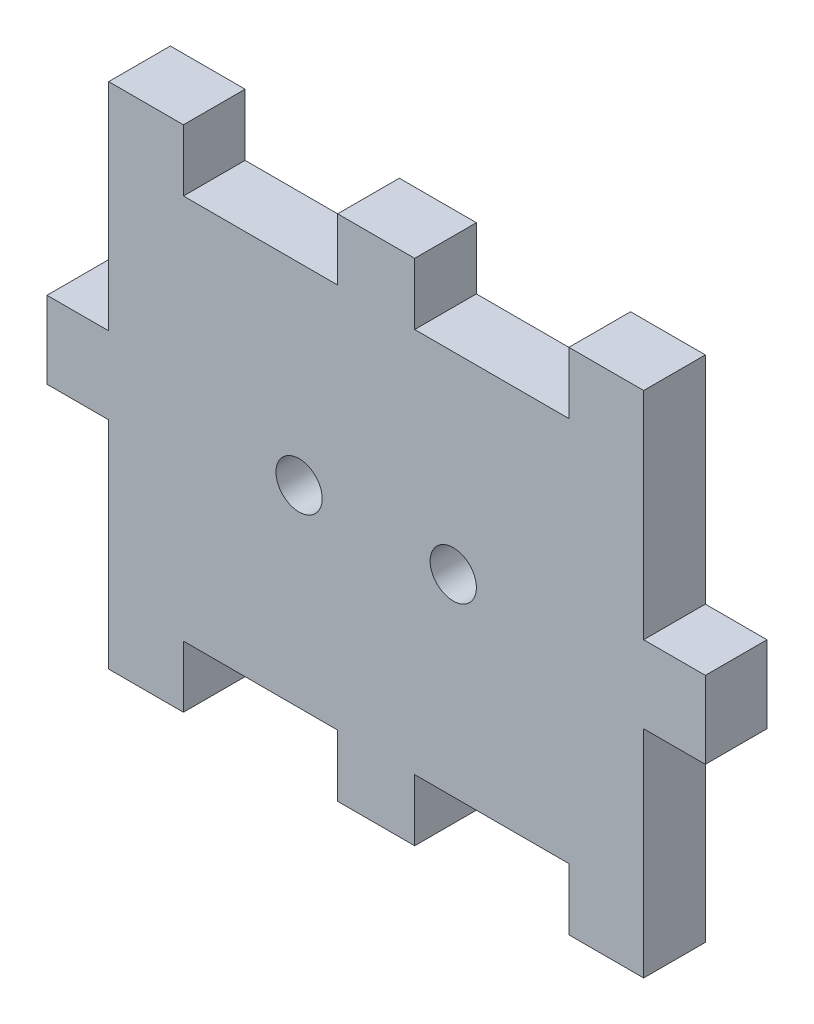
ISO-10303-21;
HEADER;
FILE_DESCRIPTION(('STEP AP214'),'2;1');
FILE_NAME('part.step','',(''),(''),'','','');
FILE_SCHEMA(('AUTOMOTIVE_DESIGN { 1 0 10303 214 1 1 1 1 }'));
ENDSEC;
DATA;
#1=APPLICATION_CONTEXT('core data for automotive mechanical design processes');
#2=APPLICATION_PROTOCOL_DEFINITION('international standard','automotive_design',2000,#1);
#3=PRODUCT_CONTEXT('',#1,'mechanical');
#4=PRODUCT('Part','Part','',(#3));
#5=PRODUCT_RELATED_PRODUCT_CATEGORY('part','',(#4));
#6=PRODUCT_DEFINITION_FORMATION('','',#4);
#7=PRODUCT_DEFINITION_CONTEXT('part definition',#1,'design');
#8=PRODUCT_DEFINITION('design','',#6,#7);
#9=PRODUCT_DEFINITION_SHAPE('','',#8);
#10=(LENGTH_UNIT() NAMED_UNIT(*) SI_UNIT(.MILLI.,.METRE.));
#11=(NAMED_UNIT(*) PLANE_ANGLE_UNIT() SI_UNIT($,.RADIAN.));
#12=(NAMED_UNIT(*) SI_UNIT($,.STERADIAN.) SOLID_ANGLE_UNIT());
#13=UNCERTAINTY_MEASURE_WITH_UNIT(LENGTH_MEASURE(1.E-05),#10,'distance_accuracy_value','');
#14=(GEOMETRIC_REPRESENTATION_CONTEXT(3) GLOBAL_UNCERTAINTY_ASSIGNED_CONTEXT((#13)) GLOBAL_UNIT_ASSIGNED_CONTEXT((#10,
#11,#12)) REPRESENTATION_CONTEXT('',''));
#15=CARTESIAN_POINT('',(0.,0.,0.));
#16=DIRECTION('',(0.,0.,1.));
#17=DIRECTION('',(1.,0.,0.));
#18=AXIS2_PLACEMENT_3D('',#15,#16,#17);
#19=CARTESIAN_POINT('',(-4.,-4.,4.));
#20=DIRECTION('',(0.,1.,0.));
#21=DIRECTION('',(0.,0.,1.));
#22=AXIS2_PLACEMENT_3D('',#19,#20,#21);
#23=PLANE('',#22);
#24=DIRECTION('',(1.,0.,0.));
#25=VECTOR('',#24,1.);
#26=CARTESIAN_POINT('',(-4.,-4.,0.));
#27=LINE('',#26,#25);
#28=CARTESIAN_POINT('',(0.,-4.,0.));
#29=VERTEX_POINT('',#28);
#30=CARTESIAN_POINT('',(4.85,-4.,0.));
#31=VERTEX_POINT('',#30);
#32=EDGE_CURVE('E258',#29,#31,#27,.T.);
#33=ORIENTED_EDGE('',*,*,#32,.T.);
#34=DIRECTION('',(0.,0.,1.));
#35=VECTOR('',#34,1.);
#36=CARTESIAN_POINT('',(4.85,-4.,0.));
#37=LINE('',#36,#35);
#38=CARTESIAN_POINT('',(4.85,-4.,4.));
#39=VERTEX_POINT('',#38);
#40=EDGE_CURVE('E461',#31,#39,#37,.T.);
#41=ORIENTED_EDGE('',*,*,#40,.T.);
#42=DIRECTION('',(1.,0.,0.));
#43=VECTOR('',#42,1.);
#44=CARTESIAN_POINT('',(-4.,-4.,4.));
#45=LINE('',#44,#43);
#46=CARTESIAN_POINT('',(0.,-4.,4.));
#47=VERTEX_POINT('',#46);
#48=EDGE_CURVE('E299',#47,#39,#45,.T.);
#49=ORIENTED_EDGE('',*,*,#48,.F.);
#50=DIRECTION('',(0.,0.,1.));
#51=VECTOR('',#50,1.);
#52=CARTESIAN_POINT('',(0.,-4.,0.));
#53=LINE('',#52,#51);
#54=EDGE_CURVE('E440',#29,#47,#53,.T.);
#55=ORIENTED_EDGE('',*,*,#54,.F.);
#56=EDGE_LOOP('',(#33,#41,#49,#55));
#57=FACE_BOUND('',#56,.T.);
#58=ADVANCED_FACE('F42',(#57),#23,.F.);
#59=CARTESIAN_POINT('',(29.85,-4.,0.));
#60=VERTEX_POINT('',#59);
#61=CARTESIAN_POINT('',(34.7,-4.,0.));
#62=VERTEX_POINT('',#61);
#63=EDGE_CURVE('E259',#60,#62,#27,.T.);
#64=ORIENTED_EDGE('',*,*,#63,.T.);
#65=DIRECTION('',(0.,0.,1.));
#66=VECTOR('',#65,1.);
#67=CARTESIAN_POINT('',(34.7,-4.,0.));
#68=LINE('',#67,#66);
#69=CARTESIAN_POINT('',(34.7,-4.,4.));
#70=VERTEX_POINT('',#69);
#71=EDGE_CURVE('E347',#62,#70,#68,.T.);
#72=ORIENTED_EDGE('',*,*,#71,.T.);
#73=CARTESIAN_POINT('',(29.85,-4.,4.));
#74=VERTEX_POINT('',#73);
#75=EDGE_CURVE('E291',#74,#70,#45,.T.);
#76=ORIENTED_EDGE('',*,*,#75,.F.);
#77=DIRECTION('',(0.,0.,1.));
#78=VECTOR('',#77,1.);
#79=CARTESIAN_POINT('',(29.85,-4.,0.));
#80=LINE('',#79,#78);
#81=EDGE_CURVE('E472',#60,#74,#80,.T.);
#82=ORIENTED_EDGE('',*,*,#81,.F.);
#83=EDGE_LOOP('',(#64,#72,#76,#82));
#84=FACE_BOUND('',#83,.T.);
#85=ADVANCED_FACE('F638',(#84),#23,.F.);
#86=CARTESIAN_POINT('',(-4.,29.,4.));
#87=DIRECTION('',(0.,-1.,0.));
#88=DIRECTION('',(0.,0.,-1.));
#89=AXIS2_PLACEMENT_3D('',#86,#87,#88);
#90=PLANE('',#89);
#91=DIRECTION('',(-1.,0.,0.));
#92=VECTOR('',#91,1.);
#93=CARTESIAN_POINT('',(-4.,29.,4.));
#94=LINE('',#93,#92);
#95=CARTESIAN_POINT('',(34.7,29.,4.));
#96=VERTEX_POINT('',#95);
#97=CARTESIAN_POINT('',(29.85,29.,4.));
#98=VERTEX_POINT('',#97);
#99=EDGE_CURVE('E52',#96,#98,#94,.T.);
#100=ORIENTED_EDGE('',*,*,#99,.F.);
#101=DIRECTION('',(0.,0.,1.));
#102=VECTOR('',#101,1.);
#103=CARTESIAN_POINT('',(34.7,29.,0.));
#104=LINE('',#103,#102);
#105=CARTESIAN_POINT('',(34.7,29.,0.));
#106=VERTEX_POINT('',#105);
#107=EDGE_CURVE('E594',#106,#96,#104,.T.);
#108=ORIENTED_EDGE('',*,*,#107,.F.);
#109=DIRECTION('',(-1.,0.,0.));
#110=VECTOR('',#109,1.);
#111=CARTESIAN_POINT('',(-4.,29.,0.));
#112=LINE('',#111,#110);
#113=CARTESIAN_POINT('',(29.85,29.,0.));
#114=VERTEX_POINT('',#113);
#115=EDGE_CURVE('E276',#106,#114,#112,.T.);
#116=ORIENTED_EDGE('',*,*,#115,.T.);
#117=DIRECTION('',(0.,0.,1.));
#118=VECTOR('',#117,1.);
#119=CARTESIAN_POINT('',(29.85,29.,0.));
#120=LINE('',#119,#118);
#121=EDGE_CURVE('E386',#114,#98,#120,.T.);
#122=ORIENTED_EDGE('',*,*,#121,.T.);
#123=EDGE_LOOP('',(#100,#108,#116,#122));
#124=FACE_BOUND('',#123,.T.);
#125=ADVANCED_FACE('F643',(#124),#90,.F.);
#126=CARTESIAN_POINT('',(4.85,29.,0.));
#127=VERTEX_POINT('',#126);
#128=CARTESIAN_POINT('',(0.,29.,0.));
#129=VERTEX_POINT('',#128);
#130=EDGE_CURVE('E272',#127,#129,#112,.T.);
#131=ORIENTED_EDGE('',*,*,#130,.T.);
#132=DIRECTION('',(0.,0.,1.));
#133=VECTOR('',#132,1.);
#134=CARTESIAN_POINT('',(0.,29.,0.));
#135=LINE('',#134,#133);
#136=CARTESIAN_POINT('',(0.,29.,4.));
#137=VERTEX_POINT('',#136);
#138=EDGE_CURVE('E551',#129,#137,#135,.T.);
#139=ORIENTED_EDGE('',*,*,#138,.T.);
#140=CARTESIAN_POINT('',(4.85,29.,4.));
#141=VERTEX_POINT('',#140);
#142=EDGE_CURVE('E316',#141,#137,#94,.T.);
#143=ORIENTED_EDGE('',*,*,#142,.F.);
#144=DIRECTION('',(0.,0.,1.));
#145=VECTOR('',#144,1.);
#146=CARTESIAN_POINT('',(4.85,29.,0.));
#147=LINE('',#146,#145);
#148=EDGE_CURVE('E266',#127,#141,#147,.T.);
#149=ORIENTED_EDGE('',*,*,#148,.F.);
#150=EDGE_LOOP('',(#131,#139,#143,#149));
#151=FACE_BOUND('',#150,.T.);
#152=ADVANCED_FACE('F647',(#151),#90,.F.);
#153=CARTESIAN_POINT('',(14.85,-4.,4.));
#154=VERTEX_POINT('',#153);
#155=CARTESIAN_POINT('',(19.85,-4.,4.));
#156=VERTEX_POINT('',#155);
#157=EDGE_CURVE('E247',#154,#156,#45,.T.);
#158=ORIENTED_EDGE('',*,*,#157,.F.);
#159=DIRECTION('',(0.,0.,1.));
#160=VECTOR('',#159,1.);
#161=CARTESIAN_POINT('',(14.85,-4.,0.));
#162=LINE('',#161,#160);
#163=CARTESIAN_POINT('',(14.85,-4.,0.));
#164=VERTEX_POINT('',#163);
#165=EDGE_CURVE('E233',#164,#154,#162,.T.);
#166=ORIENTED_EDGE('',*,*,#165,.F.);
#167=CARTESIAN_POINT('',(19.85,-4.,0.));
#168=VERTEX_POINT('',#167);
#169=EDGE_CURVE('E245',#164,#168,#27,.T.);
#170=ORIENTED_EDGE('',*,*,#169,.T.);
#171=DIRECTION('',(0.,0.,1.));
#172=VECTOR('',#171,1.);
#173=CARTESIAN_POINT('',(19.85,-4.,0.));
#174=LINE('',#173,#172);
#175=EDGE_CURVE('E475',#168,#156,#174,.T.);
#176=ORIENTED_EDGE('',*,*,#175,.T.);
#177=EDGE_LOOP('',(#158,#166,#170,#176));
#178=FACE_BOUND('',#177,.T.);
#179=ADVANCED_FACE('F44',(#178),#23,.F.);
#180=CARTESIAN_POINT('',(38.7,-4.,4.));
#181=DIRECTION('',(-1.,0.,0.));
#182=DIRECTION('',(0.,0.,1.));
#183=AXIS2_PLACEMENT_3D('',#180,#181,#182);
#184=PLANE('',#183);
#185=DIRECTION('',(0.,1.,0.));
#186=VECTOR('',#185,1.);
#187=CARTESIAN_POINT('',(38.7,-4.,0.));
#188=LINE('',#187,#186);
#189=CARTESIAN_POINT('',(38.7,9.99999999999999,0.));
#190=VERTEX_POINT('',#189);
#191=CARTESIAN_POINT('',(38.7,15.,0.));
#192=VERTEX_POINT('',#191);
#193=EDGE_CURVE('E264',#190,#192,#188,.T.);
#194=ORIENTED_EDGE('',*,*,#193,.T.);
#195=DIRECTION('',(0.,0.,1.));
#196=VECTOR('',#195,1.);
#197=CARTESIAN_POINT('',(38.7,15.,0.));
#198=LINE('',#197,#196);
#199=CARTESIAN_POINT('',(38.7,15.,4.));
#200=VERTEX_POINT('',#199);
#201=EDGE_CURVE('E360',#192,#200,#198,.T.);
#202=ORIENTED_EDGE('',*,*,#201,.T.);
#203=DIRECTION('',(0.,1.,0.));
#204=VECTOR('',#203,1.);
#205=CARTESIAN_POINT('',(38.7,-4.,4.));
#206=LINE('',#205,#204);
#207=CARTESIAN_POINT('',(38.7,9.99999999999999,4.));
#208=VERTEX_POINT('',#207);
#209=EDGE_CURVE('E310',#208,#200,#206,.T.);
#210=ORIENTED_EDGE('',*,*,#209,.F.);
#211=DIRECTION('',(0.,0.,1.));
#212=VECTOR('',#211,1.);
#213=CARTESIAN_POINT('',(38.7,9.99999999999999,0.));
#214=LINE('',#213,#212);
#215=EDGE_CURVE('E343',#190,#208,#214,.T.);
#216=ORIENTED_EDGE('',*,*,#215,.F.);
#217=EDGE_LOOP('',(#194,#202,#210,#216));
#218=FACE_BOUND('',#217,.T.);
#219=ADVANCED_FACE('F646',(#218),#184,.F.);
#220=CARTESIAN_POINT('',(19.85,29.,4.));
#221=VERTEX_POINT('',#220);
#222=CARTESIAN_POINT('',(14.85,29.,4.));
#223=VERTEX_POINT('',#222);
#224=EDGE_CURVE('E322',#221,#223,#94,.T.);
#225=ORIENTED_EDGE('',*,*,#224,.F.);
#226=DIRECTION('',(0.,0.,1.));
#227=VECTOR('',#226,1.);
#228=CARTESIAN_POINT('',(19.85,29.,0.));
#229=LINE('',#228,#227);
#230=CARTESIAN_POINT('',(19.85,29.,0.));
#231=VERTEX_POINT('',#230);
#232=EDGE_CURVE('E396',#231,#221,#229,.T.);
#233=ORIENTED_EDGE('',*,*,#232,.F.);
#234=CARTESIAN_POINT('',(14.85,29.,0.));
#235=VERTEX_POINT('',#234);
#236=EDGE_CURVE('E275',#231,#235,#112,.T.);
#237=ORIENTED_EDGE('',*,*,#236,.T.);
#238=DIRECTION('',(0.,0.,1.));
#239=VECTOR('',#238,1.);
#240=CARTESIAN_POINT('',(14.85,29.,0.));
#241=LINE('',#240,#239);
#242=EDGE_CURVE('E513',#235,#223,#241,.T.);
#243=ORIENTED_EDGE('',*,*,#242,.T.);
#244=EDGE_LOOP('',(#225,#233,#237,#243));
#245=FACE_BOUND('',#244,.T.);
#246=ADVANCED_FACE('F633',(#245),#90,.F.);
#247=CARTESIAN_POINT('',(-4.,-4.,4.));
#248=DIRECTION('',(1.,0.,0.));
#249=DIRECTION('',(0.,0.,-1.));
#250=AXIS2_PLACEMENT_3D('',#247,#248,#249);
#251=PLANE('',#250);
#252=DIRECTION('',(0.,-1.,0.));
#253=VECTOR('',#252,1.);
#254=CARTESIAN_POINT('',(-4.,-4.,0.));
#255=LINE('',#254,#253);
#256=CARTESIAN_POINT('',(-4.,15.,0.));
#257=VERTEX_POINT('',#256);
#258=CARTESIAN_POINT('',(-4.,10.,0.));
#259=VERTEX_POINT('',#258);
#260=EDGE_CURVE('E46',#257,#259,#255,.T.);
#261=ORIENTED_EDGE('',*,*,#260,.T.);
#262=DIRECTION('',(0.,0.,1.));
#263=VECTOR('',#262,1.);
#264=CARTESIAN_POINT('',(-4.,10.,0.));
#265=LINE('',#264,#263);
#266=CARTESIAN_POINT('',(-4.,10.,4.));
#267=VERTEX_POINT('',#266);
#268=EDGE_CURVE('E415',#259,#267,#265,.T.);
#269=ORIENTED_EDGE('',*,*,#268,.T.);
#270=DIRECTION('',(0.,-1.,0.));
#271=VECTOR('',#270,1.);
#272=CARTESIAN_POINT('',(-4.,-4.,4.));
#273=LINE('',#272,#271);
#274=CARTESIAN_POINT('',(-4.,15.,4.));
#275=VERTEX_POINT('',#274);
#276=EDGE_CURVE('E12',#275,#267,#273,.T.);
#277=ORIENTED_EDGE('',*,*,#276,.F.);
#278=DIRECTION('',(0.,0.,1.));
#279=VECTOR('',#278,1.);
#280=CARTESIAN_POINT('',(-4.,15.,0.));
#281=LINE('',#280,#279);
#282=EDGE_CURVE('E409',#257,#275,#281,.T.);
#283=ORIENTED_EDGE('',*,*,#282,.F.);
#284=EDGE_LOOP('',(#261,#269,#277,#283));
#285=FACE_BOUND('',#284,.T.);
#286=ADVANCED_FACE('F624',(#285),#251,.F.);
#287=CARTESIAN_POINT('',(0.,0.,4.));
#288=DIRECTION('',(0.,0.,1.));
#289=DIRECTION('',(1.,0.,0.));
#290=AXIS2_PLACEMENT_3D('',#287,#288,#289);
#291=PLANE('',#290);
#292=CARTESIAN_POINT('',(12.35,12.5,4.));
#293=DIRECTION('',(0.,0.,1.));
#294=DIRECTION('',(1.,0.,0.));
#295=AXIS2_PLACEMENT_3D('',#292,#293,#294);
#296=CIRCLE('',#295,1.5);
#297=CARTESIAN_POINT('',(13.85,12.5,4.));
#298=VERTEX_POINT('',#297);
#299=EDGE_CURVE('E604',#298,#298,#296,.T.);
#300=ORIENTED_EDGE('',*,*,#299,.F.);
#301=EDGE_LOOP('',(#300));
#302=FACE_BOUND('',#301,.T.);
#303=DIRECTION('',(1.,0.,0.));
#304=VECTOR('',#303,1.);
#305=CARTESIAN_POINT('',(38.7,15.,4.));
#306=LINE('',#305,#304);
#307=CARTESIAN_POINT('',(34.7,15.,4.));
#308=VERTEX_POINT('',#307);
#309=EDGE_CURVE('E361',#308,#200,#306,.T.);
#310=ORIENTED_EDGE('',*,*,#309,.F.);
#311=DIRECTION('',(0.,-1.,0.));
#312=VECTOR('',#311,1.);
#313=CARTESIAN_POINT('',(34.7,15.,4.));
#314=LINE('',#313,#312);
#315=EDGE_CURVE('E357',#96,#308,#314,.T.);
#316=ORIENTED_EDGE('',*,*,#315,.F.);
#317=ORIENTED_EDGE('',*,*,#99,.T.);
#318=DIRECTION('',(0.,1.,0.));
#319=VECTOR('',#318,1.);
#320=CARTESIAN_POINT('',(29.85,29.,4.));
#321=LINE('',#320,#319);
#322=CARTESIAN_POINT('',(29.85,25.,4.));
#323=VERTEX_POINT('',#322);
#324=EDGE_CURVE('E378',#323,#98,#321,.T.);
#325=ORIENTED_EDGE('',*,*,#324,.F.);
#326=DIRECTION('',(1.,0.,0.));
#327=VECTOR('',#326,1.);
#328=CARTESIAN_POINT('',(29.85,25.,4.));
#329=LINE('',#328,#327);
#330=CARTESIAN_POINT('',(19.85,25.,4.));
#331=VERTEX_POINT('',#330);
#332=EDGE_CURVE('E383',#331,#323,#329,.T.);
#333=ORIENTED_EDGE('',*,*,#332,.F.);
#334=DIRECTION('',(0.,-1.,0.));
#335=VECTOR('',#334,1.);
#336=CARTESIAN_POINT('',(19.85,29.,4.));
#337=LINE('',#336,#335);
#338=EDGE_CURVE('E548',#221,#331,#337,.T.);
#339=ORIENTED_EDGE('',*,*,#338,.F.);
#340=ORIENTED_EDGE('',*,*,#224,.T.);
#341=DIRECTION('',(0.,1.,0.));
#342=VECTOR('',#341,1.);
#343=CARTESIAN_POINT('',(14.85,29.,4.));
#344=LINE('',#343,#342);
#345=CARTESIAN_POINT('',(14.85,25.,4.));
#346=VERTEX_POINT('',#345);
#347=EDGE_CURVE('E488',#346,#223,#344,.T.);
#348=ORIENTED_EDGE('',*,*,#347,.F.);
#349=DIRECTION('',(1.,0.,0.));
#350=VECTOR('',#349,1.);
#351=CARTESIAN_POINT('',(4.85,25.,4.));
#352=LINE('',#351,#350);
#353=CARTESIAN_POINT('',(4.85,25.,4.));
#354=VERTEX_POINT('',#353);
#355=EDGE_CURVE('E501',#354,#346,#352,.T.);
#356=ORIENTED_EDGE('',*,*,#355,.F.);
#357=DIRECTION('',(0.,-1.,0.));
#358=VECTOR('',#357,1.);
#359=CARTESIAN_POINT('',(4.85,29.,4.));
#360=LINE('',#359,#358);
#361=EDGE_CURVE('E389',#141,#354,#360,.T.);
#362=ORIENTED_EDGE('',*,*,#361,.F.);
#363=ORIENTED_EDGE('',*,*,#142,.T.);
#364=DIRECTION('',(0.,1.,0.));
#365=VECTOR('',#364,1.);
#366=CARTESIAN_POINT('',(0.,15.,4.));
#367=LINE('',#366,#365);
#368=CARTESIAN_POINT('',(0.,15.,4.));
#369=VERTEX_POINT('',#368);
#370=EDGE_CURVE('E405',#369,#137,#367,.T.);
#371=ORIENTED_EDGE('',*,*,#370,.F.);
#372=DIRECTION('',(1.,0.,0.));
#373=VECTOR('',#372,1.);
#374=CARTESIAN_POINT('',(-4.,15.,4.));
#375=LINE('',#374,#373);
#376=EDGE_CURVE('E410',#275,#369,#375,.T.);
#377=ORIENTED_EDGE('',*,*,#376,.F.);
#378=ORIENTED_EDGE('',*,*,#276,.T.);
#379=DIRECTION('',(-1.,0.,0.));
#380=VECTOR('',#379,1.);
#381=CARTESIAN_POINT('',(-4.,10.,4.));
#382=LINE('',#381,#380);
#383=CARTESIAN_POINT('',(0.,10.,4.));
#384=VERTEX_POINT('',#383);
#385=EDGE_CURVE('E427',#384,#267,#382,.T.);
#386=ORIENTED_EDGE('',*,*,#385,.F.);
#387=DIRECTION('',(0.,1.,0.));
#388=VECTOR('',#387,1.);
#389=CARTESIAN_POINT('',(0.,10.,4.));
#390=LINE('',#389,#388);
#391=EDGE_CURVE('E432',#47,#384,#390,.T.);
#392=ORIENTED_EDGE('',*,*,#391,.F.);
#393=ORIENTED_EDGE('',*,*,#48,.T.);
#394=DIRECTION('',(0.,-1.,0.));
#395=VECTOR('',#394,1.);
#396=CARTESIAN_POINT('',(4.85,-4.,4.));
#397=LINE('',#396,#395);
#398=CARTESIAN_POINT('',(4.85,0.,4.));
#399=VERTEX_POINT('',#398);
#400=EDGE_CURVE('E239',#399,#39,#397,.T.);
#401=ORIENTED_EDGE('',*,*,#400,.F.);
#402=DIRECTION('',(-1.,0.,0.));
#403=VECTOR('',#402,1.);
#404=CARTESIAN_POINT('',(4.85,0.,4.));
#405=LINE('',#404,#403);
#406=CARTESIAN_POINT('',(14.85,0.,4.));
#407=VERTEX_POINT('',#406);
#408=EDGE_CURVE('E582',#407,#399,#405,.T.);
#409=ORIENTED_EDGE('',*,*,#408,.F.);
#410=DIRECTION('',(0.,1.,0.));
#411=VECTOR('',#410,1.);
#412=CARTESIAN_POINT('',(14.85,-4.,4.));
#413=LINE('',#412,#411);
#414=EDGE_CURVE('E346',#154,#407,#413,.T.);
#415=ORIENTED_EDGE('',*,*,#414,.F.);
#416=ORIENTED_EDGE('',*,*,#157,.T.);
#417=DIRECTION('',(0.,-1.,0.));
#418=VECTOR('',#417,1.);
#419=CARTESIAN_POINT('',(19.85,-4.,4.));
#420=LINE('',#419,#418);
#421=CARTESIAN_POINT('',(19.85,0.,4.));
#422=VERTEX_POINT('',#421);
#423=EDGE_CURVE('E449',#422,#156,#420,.T.);
#424=ORIENTED_EDGE('',*,*,#423,.F.);
#425=DIRECTION('',(-1.,0.,0.));
#426=VECTOR('',#425,1.);
#427=CARTESIAN_POINT('',(29.85,0.,4.));
#428=LINE('',#427,#426);
#429=CARTESIAN_POINT('',(29.85,0.,4.));
#430=VERTEX_POINT('',#429);
#431=EDGE_CURVE('E460',#430,#422,#428,.T.);
#432=ORIENTED_EDGE('',*,*,#431,.F.);
#433=DIRECTION('',(0.,1.,0.));
#434=VECTOR('',#433,1.);
#435=CARTESIAN_POINT('',(29.85,-4.,4.));
#436=LINE('',#435,#434);
#437=EDGE_CURVE('E455',#74,#430,#436,.T.);
#438=ORIENTED_EDGE('',*,*,#437,.F.);
#439=ORIENTED_EDGE('',*,*,#75,.T.);
#440=DIRECTION('',(0.,-1.,0.));
#441=VECTOR('',#440,1.);
#442=CARTESIAN_POINT('',(34.7,9.99999999999999,4.));
#443=LINE('',#442,#441);
#444=CARTESIAN_POINT('',(34.7,9.99999999999999,4.));
#445=VERTEX_POINT('',#444);
#446=EDGE_CURVE('E335',#445,#70,#443,.T.);
#447=ORIENTED_EDGE('',*,*,#446,.F.);
#448=DIRECTION('',(-1.,0.,0.));
#449=VECTOR('',#448,1.);
#450=CARTESIAN_POINT('',(38.7,9.99999999999999,4.));
#451=LINE('',#450,#449);
#452=EDGE_CURVE('E330',#208,#445,#451,.T.);
#453=ORIENTED_EDGE('',*,*,#452,.F.);
#454=ORIENTED_EDGE('',*,*,#209,.T.);
#455=EDGE_LOOP('',(#310,#316,#317,#325,#333,#339,#340,#348,#356,#362,#363,#371,#377,#378,#386,
#392,#393,#401,#409,#415,#416,#424,#432,#438,#439,#447,#453,#454));
#456=FACE_BOUND('',#455,.T.);
#457=CARTESIAN_POINT('',(22.35,12.5,4.));
#458=DIRECTION('',(0.,0.,1.));
#459=DIRECTION('',(-1.,0.,0.));
#460=AXIS2_PLACEMENT_3D('',#457,#458,#459);
#461=CIRCLE('',#460,1.5);
#462=CARTESIAN_POINT('',(20.85,12.5,4.));
#463=VERTEX_POINT('',#462);
#464=EDGE_CURVE('E611',#463,#463,#461,.T.);
#465=ORIENTED_EDGE('',*,*,#464,.F.);
#466=EDGE_LOOP('',(#465));
#467=FACE_BOUND('',#466,.T.);
#468=ADVANCED_FACE('F531',(#302,#456,#467),#291,.T.);
#469=CARTESIAN_POINT('',(0.,0.,0.));
#470=DIRECTION('',(0.,0.,1.));
#471=DIRECTION('',(1.,0.,0.));
#472=AXIS2_PLACEMENT_3D('',#469,#470,#471);
#473=PLANE('',#472);
#474=CARTESIAN_POINT('',(12.35,12.5,0.));
#475=DIRECTION('',(0.,0.,1.));
#476=DIRECTION('',(1.,0.,0.));
#477=AXIS2_PLACEMENT_3D('',#474,#475,#476);
#478=CIRCLE('',#477,1.5);
#479=CARTESIAN_POINT('',(13.85,12.5,0.));
#480=VERTEX_POINT('',#479);
#481=EDGE_CURVE('E365',#480,#480,#478,.T.);
#482=ORIENTED_EDGE('',*,*,#481,.T.);
#483=EDGE_LOOP('',(#482));
#484=FACE_BOUND('',#483,.T.);
#485=DIRECTION('',(0.,-1.,0.));
#486=VECTOR('',#485,1.);
#487=CARTESIAN_POINT('',(34.7,15.,0.));
#488=LINE('',#487,#486);
#489=CARTESIAN_POINT('',(34.7,15.,0.));
#490=VERTEX_POINT('',#489);
#491=EDGE_CURVE('E356',#106,#490,#488,.T.);
#492=ORIENTED_EDGE('',*,*,#491,.T.);
#493=DIRECTION('',(1.,0.,0.));
#494=VECTOR('',#493,1.);
#495=CARTESIAN_POINT('',(38.7,15.,0.));
#496=LINE('',#495,#494);
#497=EDGE_CURVE('E60',#490,#192,#496,.T.);
#498=ORIENTED_EDGE('',*,*,#497,.T.);
#499=ORIENTED_EDGE('',*,*,#193,.F.);
#500=DIRECTION('',(-1.,0.,0.));
#501=VECTOR('',#500,1.);
#502=CARTESIAN_POINT('',(38.7,9.99999999999999,0.));
#503=LINE('',#502,#501);
#504=CARTESIAN_POINT('',(34.7,9.99999999999999,0.));
#505=VERTEX_POINT('',#504);
#506=EDGE_CURVE('E342',#190,#505,#503,.T.);
#507=ORIENTED_EDGE('',*,*,#506,.T.);
#508=DIRECTION('',(0.,-1.,0.));
#509=VECTOR('',#508,1.);
#510=CARTESIAN_POINT('',(34.7,9.99999999999999,0.));
#511=LINE('',#510,#509);
#512=EDGE_CURVE('E337',#505,#62,#511,.T.);
#513=ORIENTED_EDGE('',*,*,#512,.T.);
#514=ORIENTED_EDGE('',*,*,#63,.F.);
#515=DIRECTION('',(0.,1.,0.));
#516=VECTOR('',#515,1.);
#517=CARTESIAN_POINT('',(29.85,-4.,0.));
#518=LINE('',#517,#516);
#519=CARTESIAN_POINT('',(29.85,0.,0.));
#520=VERTEX_POINT('',#519);
#521=EDGE_CURVE('E444',#60,#520,#518,.T.);
#522=ORIENTED_EDGE('',*,*,#521,.T.);
#523=DIRECTION('',(-1.,0.,0.));
#524=VECTOR('',#523,1.);
#525=CARTESIAN_POINT('',(29.85,0.,0.));
#526=LINE('',#525,#524);
#527=CARTESIAN_POINT('',(19.85,0.,0.));
#528=VERTEX_POINT('',#527);
#529=EDGE_CURVE('E448',#520,#528,#526,.T.);
#530=ORIENTED_EDGE('',*,*,#529,.T.);
#531=DIRECTION('',(0.,-1.,0.));
#532=VECTOR('',#531,1.);
#533=CARTESIAN_POINT('',(19.85,-4.,0.));
#534=LINE('',#533,#532);
#535=EDGE_CURVE('E256',#528,#168,#534,.T.);
#536=ORIENTED_EDGE('',*,*,#535,.T.);
#537=ORIENTED_EDGE('',*,*,#169,.F.);
#538=DIRECTION('',(0.,1.,0.));
#539=VECTOR('',#538,1.);
#540=CARTESIAN_POINT('',(14.85,-4.,0.));
#541=LINE('',#540,#539);
#542=CARTESIAN_POINT('',(14.85,0.,0.));
#543=VERTEX_POINT('',#542);
#544=EDGE_CURVE('E229',#164,#543,#541,.T.);
#545=ORIENTED_EDGE('',*,*,#544,.T.);
#546=DIRECTION('',(-1.,0.,0.));
#547=VECTOR('',#546,1.);
#548=CARTESIAN_POINT('',(4.85,0.,0.));
#549=LINE('',#548,#547);
#550=CARTESIAN_POINT('',(4.85,0.,0.));
#551=VERTEX_POINT('',#550);
#552=EDGE_CURVE('E68',#543,#551,#549,.T.);
#553=ORIENTED_EDGE('',*,*,#552,.T.);
#554=DIRECTION('',(0.,-1.,0.));
#555=VECTOR('',#554,1.);
#556=CARTESIAN_POINT('',(4.85,-4.,0.));
#557=LINE('',#556,#555);
#558=EDGE_CURVE('E249',#551,#31,#557,.T.);
#559=ORIENTED_EDGE('',*,*,#558,.T.);
#560=ORIENTED_EDGE('',*,*,#32,.F.);
#561=DIRECTION('',(0.,1.,0.));
#562=VECTOR('',#561,1.);
#563=CARTESIAN_POINT('',(0.,10.,0.));
#564=LINE('',#563,#562);
#565=CARTESIAN_POINT('',(0.,10.,0.));
#566=VERTEX_POINT('',#565);
#567=EDGE_CURVE('E431',#29,#566,#564,.T.);
#568=ORIENTED_EDGE('',*,*,#567,.T.);
#569=DIRECTION('',(-1.,0.,0.));
#570=VECTOR('',#569,1.);
#571=CARTESIAN_POINT('',(-4.,10.,0.));
#572=LINE('',#571,#570);
#573=EDGE_CURVE('E443',#566,#259,#572,.T.);
#574=ORIENTED_EDGE('',*,*,#573,.T.);
#575=ORIENTED_EDGE('',*,*,#260,.F.);
#576=DIRECTION('',(1.,0.,0.));
#577=VECTOR('',#576,1.);
#578=CARTESIAN_POINT('',(-4.,15.,0.));
#579=LINE('',#578,#577);
#580=CARTESIAN_POINT('',(0.,15.,0.));
#581=VERTEX_POINT('',#580);
#582=EDGE_CURVE('E400',#257,#581,#579,.T.);
#583=ORIENTED_EDGE('',*,*,#582,.T.);
#584=DIRECTION('',(0.,1.,0.));
#585=VECTOR('',#584,1.);
#586=CARTESIAN_POINT('',(0.,15.,0.));
#587=LINE('',#586,#585);
#588=EDGE_CURVE('E404',#581,#129,#587,.T.);
#589=ORIENTED_EDGE('',*,*,#588,.T.);
#590=ORIENTED_EDGE('',*,*,#130,.F.);
#591=DIRECTION('',(0.,-1.,0.));
#592=VECTOR('',#591,1.);
#593=CARTESIAN_POINT('',(4.85,29.,0.));
#594=LINE('',#593,#592);
#595=CARTESIAN_POINT('',(4.85,25.,0.));
#596=VERTEX_POINT('',#595);
#597=EDGE_CURVE('E483',#127,#596,#594,.T.);
#598=ORIENTED_EDGE('',*,*,#597,.T.);
#599=DIRECTION('',(1.,0.,0.));
#600=VECTOR('',#599,1.);
#601=CARTESIAN_POINT('',(4.85,25.,0.));
#602=LINE('',#601,#600);
#603=CARTESIAN_POINT('',(14.85,25.,0.));
#604=VERTEX_POINT('',#603);
#605=EDGE_CURVE('E487',#596,#604,#602,.T.);
#606=ORIENTED_EDGE('',*,*,#605,.T.);
#607=DIRECTION('',(0.,1.,0.));
#608=VECTOR('',#607,1.);
#609=CARTESIAN_POINT('',(14.85,29.,0.));
#610=LINE('',#609,#608);
#611=EDGE_CURVE('E492',#604,#235,#610,.T.);
#612=ORIENTED_EDGE('',*,*,#611,.T.);
#613=ORIENTED_EDGE('',*,*,#236,.F.);
#614=DIRECTION('',(0.,-1.,0.));
#615=VECTOR('',#614,1.);
#616=CARTESIAN_POINT('',(19.85,29.,0.));
#617=LINE('',#616,#615);
#618=CARTESIAN_POINT('',(19.85,25.,0.));
#619=VERTEX_POINT('',#618);
#620=EDGE_CURVE('E382',#231,#619,#617,.T.);
#621=ORIENTED_EDGE('',*,*,#620,.T.);
#622=DIRECTION('',(1.,0.,0.));
#623=VECTOR('',#622,1.);
#624=CARTESIAN_POINT('',(29.85,25.,0.));
#625=LINE('',#624,#623);
#626=CARTESIAN_POINT('',(29.85,25.,0.));
#627=VERTEX_POINT('',#626);
#628=EDGE_CURVE('E538',#619,#627,#625,.T.);
#629=ORIENTED_EDGE('',*,*,#628,.T.);
#630=DIRECTION('',(0.,1.,0.));
#631=VECTOR('',#630,1.);
#632=CARTESIAN_POINT('',(29.85,29.,0.));
#633=LINE('',#632,#631);
#634=EDGE_CURVE('E399',#627,#114,#633,.T.);
#635=ORIENTED_EDGE('',*,*,#634,.T.);
#636=ORIENTED_EDGE('',*,*,#115,.F.);
#637=EDGE_LOOP('',(#492,#498,#499,#507,#513,#514,#522,#530,#536,#537,#545,#553,#559,#560,#568,
#574,#575,#583,#589,#590,#598,#606,#612,#613,#621,#629,#635,#636));
#638=FACE_BOUND('',#637,.T.);
#639=CARTESIAN_POINT('',(22.35,12.5,0.));
#640=DIRECTION('',(0.,0.,1.));
#641=DIRECTION('',(-1.,0.,0.));
#642=AXIS2_PLACEMENT_3D('',#639,#640,#641);
#643=CIRCLE('',#642,1.5);
#644=CARTESIAN_POINT('',(20.85,12.5,0.));
#645=VERTEX_POINT('',#644);
#646=EDGE_CURVE('E608',#645,#645,#643,.T.);
#647=ORIENTED_EDGE('',*,*,#646,.T.);
#648=EDGE_LOOP('',(#647));
#649=FACE_BOUND('',#648,.T.);
#650=ADVANCED_FACE('F253',(#484,#638,#649),#473,.F.);
#651=CARTESIAN_POINT('',(4.85,29.,0.));
#652=DIRECTION('',(-1.,0.,0.));
#653=DIRECTION('',(0.,-1.,0.));
#654=AXIS2_PLACEMENT_3D('',#651,#652,#653);
#655=PLANE('',#654);
#656=ORIENTED_EDGE('',*,*,#361,.T.);
#657=DIRECTION('',(0.,0.,1.));
#658=VECTOR('',#657,1.);
#659=CARTESIAN_POINT('',(4.85,25.,0.));
#660=LINE('',#659,#658);
#661=EDGE_CURVE('E496',#596,#354,#660,.T.);
#662=ORIENTED_EDGE('',*,*,#661,.F.);
#663=ORIENTED_EDGE('',*,*,#597,.F.);
#664=ORIENTED_EDGE('',*,*,#148,.T.);
#665=EDGE_LOOP('',(#656,#662,#663,#664));
#666=FACE_BOUND('',#665,.T.);
#667=ADVANCED_FACE('F529',(#666),#655,.F.);
#668=CARTESIAN_POINT('',(14.85,29.,0.));
#669=DIRECTION('',(1.,0.,0.));
#670=DIRECTION('',(0.,1.,0.));
#671=AXIS2_PLACEMENT_3D('',#668,#669,#670);
#672=PLANE('',#671);
#673=ORIENTED_EDGE('',*,*,#347,.T.);
#674=ORIENTED_EDGE('',*,*,#242,.F.);
#675=ORIENTED_EDGE('',*,*,#611,.F.);
#676=DIRECTION('',(0.,0.,1.));
#677=VECTOR('',#676,1.);
#678=CARTESIAN_POINT('',(14.85,25.,0.));
#679=LINE('',#678,#677);
#680=EDGE_CURVE('E517',#604,#346,#679,.T.);
#681=ORIENTED_EDGE('',*,*,#680,.T.);
#682=EDGE_LOOP('',(#673,#674,#675,#681));
#683=FACE_BOUND('',#682,.T.);
#684=ADVANCED_FACE('F717',(#683),#672,.F.);
#685=CARTESIAN_POINT('',(4.85,25.,0.));
#686=DIRECTION('',(0.,-1.,0.));
#687=DIRECTION('',(0.,0.,-1.));
#688=AXIS2_PLACEMENT_3D('',#685,#686,#687);
#689=PLANE('',#688);
#690=ORIENTED_EDGE('',*,*,#355,.T.);
#691=ORIENTED_EDGE('',*,*,#680,.F.);
#692=ORIENTED_EDGE('',*,*,#605,.F.);
#693=ORIENTED_EDGE('',*,*,#661,.T.);
#694=EDGE_LOOP('',(#690,#691,#692,#693));
#695=FACE_BOUND('',#694,.T.);
#696=ADVANCED_FACE('F523',(#695),#689,.F.);
#697=CARTESIAN_POINT('',(22.35,12.5,0.));
#698=DIRECTION('',(0.,0.,1.));
#699=DIRECTION('',(1.,0.,0.));
#700=AXIS2_PLACEMENT_3D('',#697,#698,#699);
#701=CYLINDRICAL_SURFACE('',#700,1.5);
#702=ORIENTED_EDGE('',*,*,#646,.F.);
#703=EDGE_LOOP('',(#702));
#704=FACE_BOUND('',#703,.T.);
#705=ORIENTED_EDGE('',*,*,#464,.T.);
#706=EDGE_LOOP('',(#705));
#707=FACE_BOUND('',#706,.T.);
#708=ADVANCED_FACE('F622',(#704,#707),#701,.F.);
#709=CARTESIAN_POINT('',(29.85,29.,0.));
#710=DIRECTION('',(1.,0.,0.));
#711=DIRECTION('',(0.,1.,0.));
#712=AXIS2_PLACEMENT_3D('',#709,#710,#711);
#713=PLANE('',#712);
#714=ORIENTED_EDGE('',*,*,#324,.T.);
#715=ORIENTED_EDGE('',*,*,#121,.F.);
#716=ORIENTED_EDGE('',*,*,#634,.F.);
#717=DIRECTION('',(0.,0.,1.));
#718=VECTOR('',#717,1.);
#719=CARTESIAN_POINT('',(29.85,25.,0.));
#720=LINE('',#719,#718);
#721=EDGE_CURVE('E390',#627,#323,#720,.T.);
#722=ORIENTED_EDGE('',*,*,#721,.T.);
#723=EDGE_LOOP('',(#714,#715,#716,#722));
#724=FACE_BOUND('',#723,.T.);
#725=ADVANCED_FACE('F674',(#724),#713,.F.);
#726=CARTESIAN_POINT('',(29.85,25.,0.));
#727=DIRECTION('',(0.,-1.,0.));
#728=DIRECTION('',(1.,0.,0.));
#729=AXIS2_PLACEMENT_3D('',#726,#727,#728);
#730=PLANE('',#729);
#731=ORIENTED_EDGE('',*,*,#332,.T.);
#732=ORIENTED_EDGE('',*,*,#721,.F.);
#733=ORIENTED_EDGE('',*,*,#628,.F.);
#734=DIRECTION('',(0.,0.,1.));
#735=VECTOR('',#734,1.);
#736=CARTESIAN_POINT('',(19.85,25.,0.));
#737=LINE('',#736,#735);
#738=EDGE_CURVE('E393',#619,#331,#737,.T.);
#739=ORIENTED_EDGE('',*,*,#738,.T.);
#740=EDGE_LOOP('',(#731,#732,#733,#739));
#741=FACE_BOUND('',#740,.T.);
#742=ADVANCED_FACE('F677',(#741),#730,.F.);
#743=CARTESIAN_POINT('',(19.85,29.,0.));
#744=DIRECTION('',(-1.,0.,0.));
#745=DIRECTION('',(0.,-1.,0.));
#746=AXIS2_PLACEMENT_3D('',#743,#744,#745);
#747=PLANE('',#746);
#748=ORIENTED_EDGE('',*,*,#338,.T.);
#749=ORIENTED_EDGE('',*,*,#738,.F.);
#750=ORIENTED_EDGE('',*,*,#620,.F.);
#751=ORIENTED_EDGE('',*,*,#232,.T.);
#752=EDGE_LOOP('',(#748,#749,#750,#751));
#753=FACE_BOUND('',#752,.T.);
#754=ADVANCED_FACE('F679',(#753),#747,.F.);
#755=CARTESIAN_POINT('',(0.,15.,0.));
#756=DIRECTION('',(1.,0.,0.));
#757=DIRECTION('',(0.,0.,-1.));
#758=AXIS2_PLACEMENT_3D('',#755,#756,#757);
#759=PLANE('',#758);
#760=ORIENTED_EDGE('',*,*,#370,.T.);
#761=ORIENTED_EDGE('',*,*,#138,.F.);
#762=ORIENTED_EDGE('',*,*,#588,.F.);
#763=DIRECTION('',(0.,0.,1.));
#764=VECTOR('',#763,1.);
#765=CARTESIAN_POINT('',(0.,15.,0.));
#766=LINE('',#765,#764);
#767=EDGE_CURVE('E553',#581,#369,#766,.T.);
#768=ORIENTED_EDGE('',*,*,#767,.T.);
#769=EDGE_LOOP('',(#760,#761,#762,#768));
#770=FACE_BOUND('',#769,.T.);
#771=ADVANCED_FACE('F681',(#770),#759,.F.);
#772=CARTESIAN_POINT('',(-4.,15.,0.));
#773=DIRECTION('',(0.,-1.,0.));
#774=DIRECTION('',(0.,0.,-1.));
#775=AXIS2_PLACEMENT_3D('',#772,#773,#774);
#776=PLANE('',#775);
#777=ORIENTED_EDGE('',*,*,#376,.T.);
#778=ORIENTED_EDGE('',*,*,#767,.F.);
#779=ORIENTED_EDGE('',*,*,#582,.F.);
#780=ORIENTED_EDGE('',*,*,#282,.T.);
#781=EDGE_LOOP('',(#777,#778,#779,#780));
#782=FACE_BOUND('',#781,.T.);
#783=ADVANCED_FACE('F687',(#782),#776,.F.);
#784=CARTESIAN_POINT('',(-4.,10.,0.));
#785=DIRECTION('',(0.,1.,0.));
#786=DIRECTION('',(0.,0.,1.));
#787=AXIS2_PLACEMENT_3D('',#784,#785,#786);
#788=PLANE('',#787);
#789=ORIENTED_EDGE('',*,*,#385,.T.);
#790=ORIENTED_EDGE('',*,*,#268,.F.);
#791=ORIENTED_EDGE('',*,*,#573,.F.);
#792=DIRECTION('',(0.,0.,1.));
#793=VECTOR('',#792,1.);
#794=CARTESIAN_POINT('',(0.,10.,0.));
#795=LINE('',#794,#793);
#796=EDGE_CURVE('E437',#566,#384,#795,.T.);
#797=ORIENTED_EDGE('',*,*,#796,.T.);
#798=EDGE_LOOP('',(#789,#790,#791,#797));
#799=FACE_BOUND('',#798,.T.);
#800=ADVANCED_FACE('F695',(#799),#788,.F.);
#801=CARTESIAN_POINT('',(0.,10.,0.));
#802=DIRECTION('',(1.,0.,0.));
#803=DIRECTION('',(0.,0.,-1.));
#804=AXIS2_PLACEMENT_3D('',#801,#802,#803);
#805=PLANE('',#804);
#806=ORIENTED_EDGE('',*,*,#391,.T.);
#807=ORIENTED_EDGE('',*,*,#796,.F.);
#808=ORIENTED_EDGE('',*,*,#567,.F.);
#809=ORIENTED_EDGE('',*,*,#54,.T.);
#810=EDGE_LOOP('',(#806,#807,#808,#809));
#811=FACE_BOUND('',#810,.T.);
#812=ADVANCED_FACE('F699',(#811),#805,.F.);
#813=CARTESIAN_POINT('',(29.85,-4.,0.));
#814=DIRECTION('',(1.,0.,0.));
#815=DIRECTION('',(0.,1.,0.));
#816=AXIS2_PLACEMENT_3D('',#813,#814,#815);
#817=PLANE('',#816);
#818=ORIENTED_EDGE('',*,*,#437,.T.);
#819=DIRECTION('',(0.,0.,1.));
#820=VECTOR('',#819,1.);
#821=CARTESIAN_POINT('',(29.85,0.,0.));
#822=LINE('',#821,#820);
#823=EDGE_CURVE('E454',#520,#430,#822,.T.);
#824=ORIENTED_EDGE('',*,*,#823,.F.);
#825=ORIENTED_EDGE('',*,*,#521,.F.);
#826=ORIENTED_EDGE('',*,*,#81,.T.);
#827=EDGE_LOOP('',(#818,#824,#825,#826));
#828=FACE_BOUND('',#827,.T.);
#829=ADVANCED_FACE('F703',(#828),#817,.F.);
#830=CARTESIAN_POINT('',(19.85,-4.,0.));
#831=DIRECTION('',(-1.,0.,0.));
#832=DIRECTION('',(0.,-1.,0.));
#833=AXIS2_PLACEMENT_3D('',#830,#831,#832);
#834=PLANE('',#833);
#835=ORIENTED_EDGE('',*,*,#423,.T.);
#836=ORIENTED_EDGE('',*,*,#175,.F.);
#837=ORIENTED_EDGE('',*,*,#535,.F.);
#838=DIRECTION('',(0.,0.,1.));
#839=VECTOR('',#838,1.);
#840=CARTESIAN_POINT('',(19.85,0.,0.));
#841=LINE('',#840,#839);
#842=EDGE_CURVE('E478',#528,#422,#841,.T.);
#843=ORIENTED_EDGE('',*,*,#842,.T.);
#844=EDGE_LOOP('',(#835,#836,#837,#843));
#845=FACE_BOUND('',#844,.T.);
#846=ADVANCED_FACE('F705',(#845),#834,.F.);
#847=CARTESIAN_POINT('',(29.85,0.,0.));
#848=DIRECTION('',(0.,1.,0.));
#849=DIRECTION('',(-1.,0.,0.));
#850=AXIS2_PLACEMENT_3D('',#847,#848,#849);
#851=PLANE('',#850);
#852=ORIENTED_EDGE('',*,*,#431,.T.);
#853=ORIENTED_EDGE('',*,*,#842,.F.);
#854=ORIENTED_EDGE('',*,*,#529,.F.);
#855=ORIENTED_EDGE('',*,*,#823,.T.);
#856=EDGE_LOOP('',(#852,#853,#854,#855));
#857=FACE_BOUND('',#856,.T.);
#858=ADVANCED_FACE('F708',(#857),#851,.F.);
#859=CARTESIAN_POINT('',(4.85,-4.,0.));
#860=DIRECTION('',(-1.,0.,0.));
#861=DIRECTION('',(0.,-1.,0.));
#862=AXIS2_PLACEMENT_3D('',#859,#860,#861);
#863=PLANE('',#862);
#864=ORIENTED_EDGE('',*,*,#400,.T.);
#865=ORIENTED_EDGE('',*,*,#40,.F.);
#866=ORIENTED_EDGE('',*,*,#558,.F.);
#867=DIRECTION('',(0.,0.,1.));
#868=VECTOR('',#867,1.);
#869=CARTESIAN_POINT('',(4.85,0.,0.));
#870=LINE('',#869,#868);
#871=EDGE_CURVE('E570',#551,#399,#870,.T.);
#872=ORIENTED_EDGE('',*,*,#871,.T.);
#873=EDGE_LOOP('',(#864,#865,#866,#872));
#874=FACE_BOUND('',#873,.T.);
#875=ADVANCED_FACE('F712',(#874),#863,.F.);
#876=CARTESIAN_POINT('',(4.85,0.,0.));
#877=DIRECTION('',(0.,1.,0.));
#878=DIRECTION('',(-1.,0.,0.));
#879=AXIS2_PLACEMENT_3D('',#876,#877,#878);
#880=PLANE('',#879);
#881=ORIENTED_EDGE('',*,*,#408,.T.);
#882=ORIENTED_EDGE('',*,*,#871,.F.);
#883=ORIENTED_EDGE('',*,*,#552,.F.);
#884=DIRECTION('',(0.,0.,1.));
#885=VECTOR('',#884,1.);
#886=CARTESIAN_POINT('',(14.85,0.,0.));
#887=LINE('',#886,#885);
#888=EDGE_CURVE('E235',#543,#407,#887,.T.);
#889=ORIENTED_EDGE('',*,*,#888,.T.);
#890=EDGE_LOOP('',(#881,#882,#883,#889));
#891=FACE_BOUND('',#890,.T.);
#892=ADVANCED_FACE('F806',(#891),#880,.F.);
#893=CARTESIAN_POINT('',(14.85,-4.,0.));
#894=DIRECTION('',(1.,0.,0.));
#895=DIRECTION('',(0.,1.,0.));
#896=AXIS2_PLACEMENT_3D('',#893,#894,#895);
#897=PLANE('',#896);
#898=ORIENTED_EDGE('',*,*,#414,.T.);
#899=ORIENTED_EDGE('',*,*,#888,.F.);
#900=ORIENTED_EDGE('',*,*,#544,.F.);
#901=ORIENTED_EDGE('',*,*,#165,.T.);
#902=EDGE_LOOP('',(#898,#899,#900,#901));
#903=FACE_BOUND('',#902,.T.);
#904=ADVANCED_FACE('F232',(#903),#897,.F.);
#905=CARTESIAN_POINT('',(38.7,9.99999999999999,0.));
#906=DIRECTION('',(0.,1.,0.));
#907=DIRECTION('',(0.,0.,1.));
#908=AXIS2_PLACEMENT_3D('',#905,#906,#907);
#909=PLANE('',#908);
#910=ORIENTED_EDGE('',*,*,#452,.T.);
#911=DIRECTION('',(0.,0.,1.));
#912=VECTOR('',#911,1.);
#913=CARTESIAN_POINT('',(34.7,9.99999999999999,0.));
#914=LINE('',#913,#912);
#915=EDGE_CURVE('E351',#505,#445,#914,.T.);
#916=ORIENTED_EDGE('',*,*,#915,.F.);
#917=ORIENTED_EDGE('',*,*,#506,.F.);
#918=ORIENTED_EDGE('',*,*,#215,.T.);
#919=EDGE_LOOP('',(#910,#916,#917,#918));
#920=FACE_BOUND('',#919,.T.);
#921=ADVANCED_FACE('F824',(#920),#909,.F.);
#922=CARTESIAN_POINT('',(34.7,9.99999999999999,0.));
#923=DIRECTION('',(-1.,0.,0.));
#924=DIRECTION('',(0.,-1.,0.));
#925=AXIS2_PLACEMENT_3D('',#922,#923,#924);
#926=PLANE('',#925);
#927=ORIENTED_EDGE('',*,*,#446,.T.);
#928=ORIENTED_EDGE('',*,*,#71,.F.);
#929=ORIENTED_EDGE('',*,*,#512,.F.);
#930=ORIENTED_EDGE('',*,*,#915,.T.);
#931=EDGE_LOOP('',(#927,#928,#929,#930));
#932=FACE_BOUND('',#931,.T.);
#933=ADVANCED_FACE('F833',(#932),#926,.F.);
#934=CARTESIAN_POINT('',(38.7,15.,0.));
#935=DIRECTION('',(0.,-1.,0.));
#936=DIRECTION('',(1.,0.,0.));
#937=AXIS2_PLACEMENT_3D('',#934,#935,#936);
#938=PLANE('',#937);
#939=ORIENTED_EDGE('',*,*,#309,.T.);
#940=ORIENTED_EDGE('',*,*,#201,.F.);
#941=ORIENTED_EDGE('',*,*,#497,.F.);
#942=DIRECTION('',(0.,0.,1.));
#943=VECTOR('',#942,1.);
#944=CARTESIAN_POINT('',(34.7,15.,0.));
#945=LINE('',#944,#943);
#946=EDGE_CURVE('E336',#490,#308,#945,.T.);
#947=ORIENTED_EDGE('',*,*,#946,.T.);
#948=EDGE_LOOP('',(#939,#940,#941,#947));
#949=FACE_BOUND('',#948,.T.);
#950=ADVANCED_FACE('F843',(#949),#938,.F.);
#951=CARTESIAN_POINT('',(34.7,15.,0.));
#952=DIRECTION('',(-1.,0.,0.));
#953=DIRECTION('',(0.,0.,1.));
#954=AXIS2_PLACEMENT_3D('',#951,#952,#953);
#955=PLANE('',#954);
#956=ORIENTED_EDGE('',*,*,#315,.T.);
#957=ORIENTED_EDGE('',*,*,#946,.F.);
#958=ORIENTED_EDGE('',*,*,#491,.F.);
#959=ORIENTED_EDGE('',*,*,#107,.T.);
#960=EDGE_LOOP('',(#956,#957,#958,#959));
#961=FACE_BOUND('',#960,.T.);
#962=ADVANCED_FACE('F853',(#961),#955,.F.);
#963=CARTESIAN_POINT('',(12.35,12.5,0.));
#964=DIRECTION('',(0.,0.,1.));
#965=DIRECTION('',(1.,0.,0.));
#966=AXIS2_PLACEMENT_3D('',#963,#964,#965);
#967=CYLINDRICAL_SURFACE('',#966,1.5);
#968=ORIENTED_EDGE('',*,*,#481,.F.);
#969=EDGE_LOOP('',(#968));
#970=FACE_BOUND('',#969,.T.);
#971=ORIENTED_EDGE('',*,*,#299,.T.);
#972=EDGE_LOOP('',(#971));
#973=FACE_BOUND('',#972,.T.);
#974=ADVANCED_FACE('F862',(#970,#973),#967,.F.);
#975=CLOSED_SHELL('',(#58,#85,#125,#152,#179,#219,#246,#286,#468,#650,#667,#684,#696,#708,#725,
#742,#754,#771,#783,#800,#812,#829,#846,#858,#875,#892,#904,#921,#933,#950,#962,#974));
#976=MANIFOLD_SOLID_BREP('B2',#975);
#977=ADVANCED_BREP_SHAPE_REPRESENTATION('',(#18,#976),#14);
#978=SHAPE_DEFINITION_REPRESENTATION(#9,#977);
ENDSEC;
END-ISO-10303-21;
